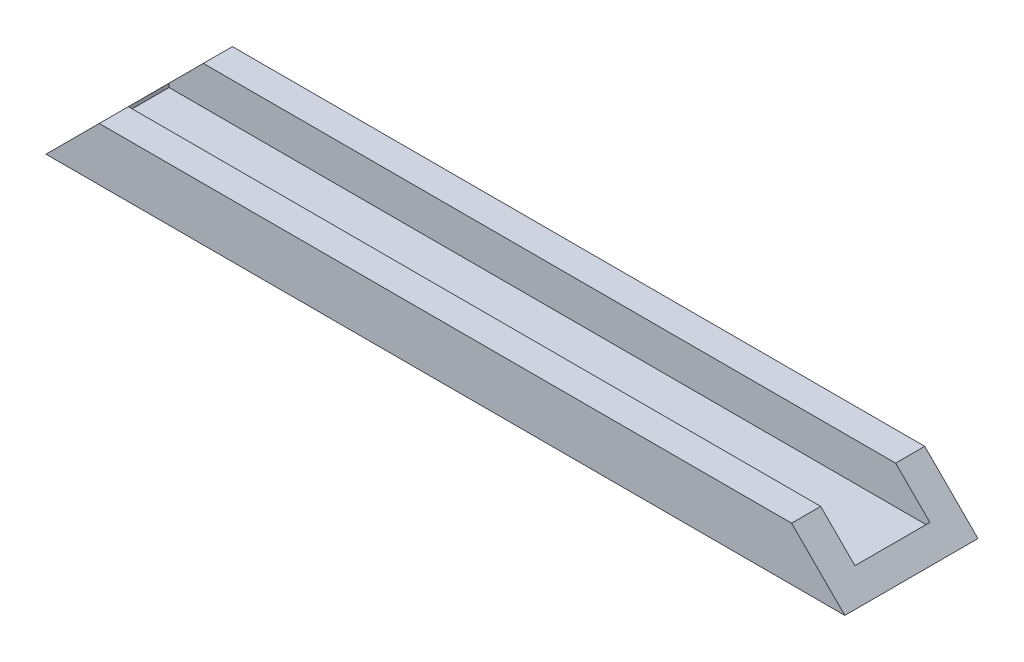
ISO-10303-21;
HEADER;
FILE_DESCRIPTION(('STEP AP214'),'2;1');
FILE_NAME('part.step','',(''),(''),'','','');
FILE_SCHEMA(('AUTOMOTIVE_DESIGN { 1 0 10303 214 1 1 1 1 }'));
ENDSEC;
DATA;
#1=APPLICATION_CONTEXT('core data for automotive mechanical design processes');
#2=APPLICATION_PROTOCOL_DEFINITION('international standard','automotive_design',2000,#1);
#3=PRODUCT_CONTEXT('',#1,'mechanical');
#4=PRODUCT('Part','Part','',(#3));
#5=PRODUCT_RELATED_PRODUCT_CATEGORY('part','',(#4));
#6=PRODUCT_DEFINITION_FORMATION('','',#4);
#7=PRODUCT_DEFINITION_CONTEXT('part definition',#1,'design');
#8=PRODUCT_DEFINITION('design','',#6,#7);
#9=PRODUCT_DEFINITION_SHAPE('','',#8);
#10=(LENGTH_UNIT() NAMED_UNIT(*) SI_UNIT(.MILLI.,.METRE.));
#11=(NAMED_UNIT(*) PLANE_ANGLE_UNIT() SI_UNIT($,.RADIAN.));
#12=(NAMED_UNIT(*) SI_UNIT($,.STERADIAN.) SOLID_ANGLE_UNIT());
#13=UNCERTAINTY_MEASURE_WITH_UNIT(LENGTH_MEASURE(1.E-05),#10,'distance_accuracy_value','');
#14=(GEOMETRIC_REPRESENTATION_CONTEXT(3) GLOBAL_UNCERTAINTY_ASSIGNED_CONTEXT((#13)) GLOBAL_UNIT_ASSIGNED_CONTEXT((#10,
#11,#12)) REPRESENTATION_CONTEXT('',''));
#15=CARTESIAN_POINT('',(0.,0.,0.));
#16=DIRECTION('',(0.,0.,1.));
#17=DIRECTION('',(1.,0.,0.));
#18=AXIS2_PLACEMENT_3D('',#15,#16,#17);
#19=CARTESIAN_POINT('',(0.,8.89,0.));
#20=DIRECTION('',(0.,-1.,0.));
#21=DIRECTION('',(0.,0.,-1.));
#22=AXIS2_PLACEMENT_3D('',#19,#20,#21);
#23=PLANE('',#22);
#24=DIRECTION('',(-1.,0.,0.));
#25=VECTOR('',#24,1.);
#26=CARTESIAN_POINT('',(0.,8.89,-22.225));
#27=LINE('',#26,#25);
#28=CARTESIAN_POINT('',(124.46,8.89000000000001,-22.225));
#29=VERTEX_POINT('',#28);
#30=CARTESIAN_POINT('',(8.89000000000008,8.89000000000001,-22.225));
#31=VERTEX_POINT('',#30);
#32=EDGE_CURVE('E129',#29,#31,#27,.T.);
#33=ORIENTED_EDGE('',*,*,#32,.T.);
#34=DIRECTION('',(0.,0.,-1.));
#35=VECTOR('',#34,1.);
#36=CARTESIAN_POINT('',(8.89000000000008,8.89000000000001,0.));
#37=LINE('',#36,#35);
#38=CARTESIAN_POINT('',(8.89000000000008,8.89000000000001,-17.36725));
#39=VERTEX_POINT('',#38);
#40=EDGE_CURVE('E115',#39,#31,#37,.T.);
#41=ORIENTED_EDGE('',*,*,#40,.F.);
#42=DIRECTION('',(-1.,0.,0.));
#43=VECTOR('',#42,1.);
#44=CARTESIAN_POINT('',(3.175,8.89,-17.36725));
#45=LINE('',#44,#43);
#46=CARTESIAN_POINT('',(124.46,8.89000000000001,-17.36725));
#47=VERTEX_POINT('',#46);
#48=EDGE_CURVE('E164',#47,#39,#45,.T.);
#49=ORIENTED_EDGE('',*,*,#48,.F.);
#50=DIRECTION('',(0.,0.,-1.));
#51=VECTOR('',#50,1.);
#52=CARTESIAN_POINT('',(124.46,8.89000000000001,0.));
#53=LINE('',#52,#51);
#54=EDGE_CURVE('E188',#47,#29,#53,.T.);
#55=ORIENTED_EDGE('',*,*,#54,.T.);
#56=EDGE_LOOP('',(#33,#41,#49,#55));
#57=FACE_BOUND('',#56,.T.);
#58=ADVANCED_FACE('F33',(#57),#23,.F.);
#59=CARTESIAN_POINT('',(0.,8.89,0.));
#60=DIRECTION('',(0.,0.,-1.));
#61=DIRECTION('',(-1.,0.,0.));
#62=AXIS2_PLACEMENT_3D('',#59,#60,#61);
#63=PLANE('',#62);
#64=DIRECTION('',(1.,0.,0.));
#65=VECTOR('',#64,1.);
#66=CARTESIAN_POINT('',(0.,8.89,0.));
#67=LINE('',#66,#65);
#68=CARTESIAN_POINT('',(8.89000000000008,8.89000000000001,0.));
#69=VERTEX_POINT('',#68);
#70=CARTESIAN_POINT('',(124.46,8.89000000000001,0.));
#71=VERTEX_POINT('',#70);
#72=EDGE_CURVE('E123',#69,#71,#67,.T.);
#73=ORIENTED_EDGE('',*,*,#72,.F.);
#74=DIRECTION('',(-0.707106781186551,-0.707106781186544,0.));
#75=VECTOR('',#74,1.);
#76=CARTESIAN_POINT('',(0.,0.,0.));
#77=LINE('',#76,#75);
#78=CARTESIAN_POINT('',(0.,0.,0.));
#79=VERTEX_POINT('',#78);
#80=EDGE_CURVE('E107',#69,#79,#77,.T.);
#81=ORIENTED_EDGE('',*,*,#80,.T.);
#82=DIRECTION('',(1.,0.,0.));
#83=VECTOR('',#82,1.);
#84=CARTESIAN_POINT('',(0.,0.,0.));
#85=LINE('',#84,#83);
#86=CARTESIAN_POINT('',(133.35,0.,0.));
#87=VERTEX_POINT('',#86);
#88=EDGE_CURVE('E142',#79,#87,#85,.T.);
#89=ORIENTED_EDGE('',*,*,#88,.T.);
#90=DIRECTION('',(-0.70710678118655,0.707106781186545,0.));
#91=VECTOR('',#90,1.);
#92=CARTESIAN_POINT('',(133.35,0.,0.));
#93=LINE('',#92,#91);
#94=EDGE_CURVE('E128',#87,#71,#93,.T.);
#95=ORIENTED_EDGE('',*,*,#94,.T.);
#96=EDGE_LOOP('',(#73,#81,#89,#95));
#97=FACE_BOUND('',#96,.T.);
#98=ADVANCED_FACE('F35',(#97),#63,.F.);
#99=CARTESIAN_POINT('',(0.,8.89,-22.225));
#100=DIRECTION('',(0.,0.,1.));
#101=DIRECTION('',(1.,0.,0.));
#102=AXIS2_PLACEMENT_3D('',#99,#100,#101);
#103=PLANE('',#102);
#104=DIRECTION('',(-1.,0.,0.));
#105=VECTOR('',#104,1.);
#106=CARTESIAN_POINT('',(0.,0.,-22.225));
#107=LINE('',#106,#105);
#108=CARTESIAN_POINT('',(133.35,0.,-22.225));
#109=VERTEX_POINT('',#108);
#110=CARTESIAN_POINT('',(0.,0.,-22.225));
#111=VERTEX_POINT('',#110);
#112=EDGE_CURVE('E130',#109,#111,#107,.T.);
#113=ORIENTED_EDGE('',*,*,#112,.T.);
#114=DIRECTION('',(-0.707106781186551,-0.707106781186544,0.));
#115=VECTOR('',#114,1.);
#116=CARTESIAN_POINT('',(0.,0.,-22.225));
#117=LINE('',#116,#115);
#118=EDGE_CURVE('E116',#31,#111,#117,.T.);
#119=ORIENTED_EDGE('',*,*,#118,.F.);
#120=ORIENTED_EDGE('',*,*,#32,.F.);
#121=DIRECTION('',(-0.70710678118655,0.707106781186545,0.));
#122=VECTOR('',#121,1.);
#123=CARTESIAN_POINT('',(133.35,0.,-22.225));
#124=LINE('',#123,#122);
#125=EDGE_CURVE('E189',#109,#29,#124,.T.);
#126=ORIENTED_EDGE('',*,*,#125,.F.);
#127=EDGE_LOOP('',(#113,#119,#120,#126));
#128=FACE_BOUND('',#127,.T.);
#129=ADVANCED_FACE('F198',(#128),#103,.F.);
#130=DIRECTION('',(1.,0.,0.));
#131=VECTOR('',#130,1.);
#132=CARTESIAN_POINT('',(3.175,8.89,-4.85775));
#133=LINE('',#132,#131);
#134=CARTESIAN_POINT('',(8.89000000000008,8.89,-4.85775));
#135=VERTEX_POINT('',#134);
#136=CARTESIAN_POINT('',(124.46,8.89000000000001,-4.85774999999998));
#137=VERTEX_POINT('',#136);
#138=EDGE_CURVE('E125',#135,#137,#133,.T.);
#139=ORIENTED_EDGE('',*,*,#138,.F.);
#140=EDGE_CURVE('E56',#69,#135,#37,.T.);
#141=ORIENTED_EDGE('',*,*,#140,.F.);
#142=ORIENTED_EDGE('',*,*,#72,.T.);
#143=EDGE_CURVE('E186',#71,#137,#53,.T.);
#144=ORIENTED_EDGE('',*,*,#143,.T.);
#145=EDGE_LOOP('',(#139,#141,#142,#144));
#146=FACE_BOUND('',#145,.T.);
#147=ADVANCED_FACE('F121',(#146),#23,.F.);
#148=CARTESIAN_POINT('',(0.,0.,0.));
#149=DIRECTION('',(0.,-1.,0.));
#150=DIRECTION('',(0.,0.,-1.));
#151=AXIS2_PLACEMENT_3D('',#148,#149,#150);
#152=PLANE('',#151);
#153=DIRECTION('',(0.,0.,1.));
#154=VECTOR('',#153,1.);
#155=CARTESIAN_POINT('',(0.,0.,0.));
#156=LINE('',#155,#154);
#157=EDGE_CURVE('E110',#111,#79,#156,.T.);
#158=ORIENTED_EDGE('',*,*,#157,.F.);
#159=ORIENTED_EDGE('',*,*,#112,.F.);
#160=DIRECTION('',(0.,0.,-1.));
#161=VECTOR('',#160,1.);
#162=CARTESIAN_POINT('',(133.35,0.,0.));
#163=LINE('',#162,#161);
#164=EDGE_CURVE('E135',#87,#109,#163,.T.);
#165=ORIENTED_EDGE('',*,*,#164,.F.);
#166=ORIENTED_EDGE('',*,*,#88,.F.);
#167=EDGE_LOOP('',(#158,#159,#165,#166));
#168=FACE_BOUND('',#167,.T.);
#169=ADVANCED_FACE('F201',(#168),#152,.T.);
#170=CARTESIAN_POINT('',(3.175,2.54,-17.36725));
#171=DIRECTION('',(-1.,0.,0.));
#172=DIRECTION('',(0.,0.,1.));
#173=AXIS2_PLACEMENT_3D('',#170,#171,#172);
#174=PLANE('',#173);
#175=DIRECTION('',(0.,1.,0.));
#176=VECTOR('',#175,1.);
#177=CARTESIAN_POINT('',(3.175,2.54,-17.36725));
#178=LINE('',#177,#176);
#179=CARTESIAN_POINT('',(3.175,2.54,-17.36725));
#180=VERTEX_POINT('',#179);
#181=CARTESIAN_POINT('',(3.175,3.17499999999999,-17.36725));
#182=VERTEX_POINT('',#181);
#183=EDGE_CURVE('E143',#180,#182,#178,.T.);
#184=ORIENTED_EDGE('',*,*,#183,.T.);
#185=DIRECTION('',(0.,0.,1.));
#186=VECTOR('',#185,1.);
#187=CARTESIAN_POINT('',(3.175,3.17499999999999,-17.36725));
#188=LINE('',#187,#186);
#189=CARTESIAN_POINT('',(3.175,3.17499999999999,-4.85775));
#190=VERTEX_POINT('',#189);
#191=EDGE_CURVE('E179',#182,#190,#188,.T.);
#192=ORIENTED_EDGE('',*,*,#191,.T.);
#193=DIRECTION('',(0.,1.,0.));
#194=VECTOR('',#193,1.);
#195=CARTESIAN_POINT('',(3.175,2.54,-4.85775));
#196=LINE('',#195,#194);
#197=CARTESIAN_POINT('',(3.175,2.54,-4.85775));
#198=VERTEX_POINT('',#197);
#199=EDGE_CURVE('E138',#198,#190,#196,.T.);
#200=ORIENTED_EDGE('',*,*,#199,.F.);
#201=DIRECTION('',(0.,0.,1.));
#202=VECTOR('',#201,1.);
#203=CARTESIAN_POINT('',(3.175,2.54,-17.36725));
#204=LINE('',#203,#202);
#205=EDGE_CURVE('E167',#180,#198,#204,.T.);
#206=ORIENTED_EDGE('',*,*,#205,.F.);
#207=EDGE_LOOP('',(#184,#192,#200,#206));
#208=FACE_BOUND('',#207,.T.);
#209=ADVANCED_FACE('F213',(#208),#174,.F.);
#210=CARTESIAN_POINT('',(3.175,2.54,-17.36725));
#211=DIRECTION('',(0.,0.,-1.));
#212=DIRECTION('',(-1.,0.,0.));
#213=AXIS2_PLACEMENT_3D('',#210,#211,#212);
#214=PLANE('',#213);
#215=ORIENTED_EDGE('',*,*,#48,.T.);
#216=DIRECTION('',(-0.707106781186551,-0.707106781186544,0.));
#217=VECTOR('',#216,1.);
#218=CARTESIAN_POINT('',(2.85750000000001,2.8575,-17.36725));
#219=LINE('',#218,#217);
#220=EDGE_CURVE('E169',#39,#182,#219,.T.);
#221=ORIENTED_EDGE('',*,*,#220,.T.);
#222=ORIENTED_EDGE('',*,*,#183,.F.);
#223=DIRECTION('',(-1.,0.,0.));
#224=VECTOR('',#223,1.);
#225=CARTESIAN_POINT('',(3.175,2.54,-17.36725));
#226=LINE('',#225,#224);
#227=CARTESIAN_POINT('',(130.175,2.54,-17.36725));
#228=VERTEX_POINT('',#227);
#229=EDGE_CURVE('E160',#228,#180,#226,.T.);
#230=ORIENTED_EDGE('',*,*,#229,.F.);
#231=DIRECTION('',(0.,1.,0.));
#232=VECTOR('',#231,1.);
#233=CARTESIAN_POINT('',(130.175,2.54,-17.36725));
#234=LINE('',#233,#232);
#235=CARTESIAN_POINT('',(130.175,3.17499999999993,-17.36725));
#236=VERTEX_POINT('',#235);
#237=EDGE_CURVE('E158',#228,#236,#234,.T.);
#238=ORIENTED_EDGE('',*,*,#237,.T.);
#239=DIRECTION('',(-0.70710678118655,0.707106781186545,0.));
#240=VECTOR('',#239,1.);
#241=CARTESIAN_POINT('',(66.9924999999994,66.3575,-17.36725));
#242=LINE('',#241,#240);
#243=EDGE_CURVE('E182',#236,#47,#242,.T.);
#244=ORIENTED_EDGE('',*,*,#243,.T.);
#245=EDGE_LOOP('',(#215,#221,#222,#230,#238,#244));
#246=FACE_BOUND('',#245,.T.);
#247=ADVANCED_FACE('F207',(#246),#214,.F.);
#248=CARTESIAN_POINT('',(130.175,2.54,-17.36725));
#249=DIRECTION('',(1.,0.,0.));
#250=DIRECTION('',(0.,0.,-1.));
#251=AXIS2_PLACEMENT_3D('',#248,#249,#250);
#252=PLANE('',#251);
#253=DIRECTION('',(0.,1.,0.));
#254=VECTOR('',#253,1.);
#255=CARTESIAN_POINT('',(130.175,2.54,-4.85774999999998));
#256=LINE('',#255,#254);
#257=CARTESIAN_POINT('',(130.175,2.54,-4.85774999999998));
#258=VERTEX_POINT('',#257);
#259=CARTESIAN_POINT('',(130.175,3.17499999999991,-4.85774999999998));
#260=VERTEX_POINT('',#259);
#261=EDGE_CURVE('E150',#258,#260,#256,.T.);
#262=ORIENTED_EDGE('',*,*,#261,.T.);
#263=DIRECTION('',(0.,0.,-1.));
#264=VECTOR('',#263,1.);
#265=CARTESIAN_POINT('',(130.175,3.17499999999993,-17.36725));
#266=LINE('',#265,#264);
#267=EDGE_CURVE('E48',#260,#236,#266,.T.);
#268=ORIENTED_EDGE('',*,*,#267,.T.);
#269=ORIENTED_EDGE('',*,*,#237,.F.);
#270=DIRECTION('',(0.,0.,-1.));
#271=VECTOR('',#270,1.);
#272=CARTESIAN_POINT('',(130.175,2.54,-17.36725));
#273=LINE('',#272,#271);
#274=EDGE_CURVE('E156',#258,#228,#273,.T.);
#275=ORIENTED_EDGE('',*,*,#274,.F.);
#276=EDGE_LOOP('',(#262,#268,#269,#275));
#277=FACE_BOUND('',#276,.T.);
#278=ADVANCED_FACE('F153',(#277),#252,.F.);
#279=CARTESIAN_POINT('',(3.175,2.54,-4.85775));
#280=DIRECTION('',(0.,0.,1.));
#281=DIRECTION('',(1.,0.,0.));
#282=AXIS2_PLACEMENT_3D('',#279,#280,#281);
#283=PLANE('',#282);
#284=ORIENTED_EDGE('',*,*,#199,.T.);
#285=DIRECTION('',(0.707106781186551,0.707106781186544,0.));
#286=VECTOR('',#285,1.);
#287=CARTESIAN_POINT('',(2.85750000000001,2.8575,-4.85775));
#288=LINE('',#287,#286);
#289=EDGE_CURVE('E11',#190,#135,#288,.T.);
#290=ORIENTED_EDGE('',*,*,#289,.T.);
#291=ORIENTED_EDGE('',*,*,#138,.T.);
#292=DIRECTION('',(0.70710678118655,-0.707106781186545,0.));
#293=VECTOR('',#292,1.);
#294=CARTESIAN_POINT('',(66.9924999999994,66.3575,-4.85774999999999));
#295=LINE('',#294,#293);
#296=EDGE_CURVE('E41',#137,#260,#295,.T.);
#297=ORIENTED_EDGE('',*,*,#296,.T.);
#298=ORIENTED_EDGE('',*,*,#261,.F.);
#299=DIRECTION('',(1.,0.,0.));
#300=VECTOR('',#299,1.);
#301=CARTESIAN_POINT('',(3.175,2.54,-4.85775));
#302=LINE('',#301,#300);
#303=EDGE_CURVE('E173',#198,#258,#302,.T.);
#304=ORIENTED_EDGE('',*,*,#303,.F.);
#305=EDGE_LOOP('',(#284,#290,#291,#297,#298,#304));
#306=FACE_BOUND('',#305,.T.);
#307=ADVANCED_FACE('F148',(#306),#283,.F.);
#308=CARTESIAN_POINT('',(0.,2.54,0.));
#309=DIRECTION('',(0.,1.,0.));
#310=DIRECTION('',(0.,0.,1.));
#311=AXIS2_PLACEMENT_3D('',#308,#309,#310);
#312=PLANE('',#311);
#313=ORIENTED_EDGE('',*,*,#205,.T.);
#314=ORIENTED_EDGE('',*,*,#303,.T.);
#315=ORIENTED_EDGE('',*,*,#274,.T.);
#316=ORIENTED_EDGE('',*,*,#229,.T.);
#317=EDGE_LOOP('',(#313,#314,#315,#316));
#318=FACE_BOUND('',#317,.T.);
#319=ADVANCED_FACE('F210',(#318),#312,.T.);
#320=CARTESIAN_POINT('',(133.35,0.,0.));
#321=DIRECTION('',(-0.707106781186545,-0.70710678118655,0.));
#322=DIRECTION('',(0.70710678118655,-0.707106781186545,0.));
#323=AXIS2_PLACEMENT_3D('',#320,#321,#322);
#324=PLANE('',#323);
#325=ORIENTED_EDGE('',*,*,#267,.F.);
#326=ORIENTED_EDGE('',*,*,#296,.F.);
#327=ORIENTED_EDGE('',*,*,#143,.F.);
#328=ORIENTED_EDGE('',*,*,#94,.F.);
#329=ORIENTED_EDGE('',*,*,#164,.T.);
#330=ORIENTED_EDGE('',*,*,#125,.T.);
#331=ORIENTED_EDGE('',*,*,#54,.F.);
#332=ORIENTED_EDGE('',*,*,#243,.F.);
#333=EDGE_LOOP('',(#325,#326,#327,#328,#329,#330,#331,#332));
#334=FACE_BOUND('',#333,.T.);
#335=ADVANCED_FACE('F202',(#334),#324,.F.);
#336=CARTESIAN_POINT('',(0.,0.,0.));
#337=DIRECTION('',(0.707106781186544,-0.707106781186551,0.));
#338=DIRECTION('',(0.707106781186551,0.707106781186544,0.));
#339=AXIS2_PLACEMENT_3D('',#336,#337,#338);
#340=PLANE('',#339);
#341=ORIENTED_EDGE('',*,*,#40,.T.);
#342=ORIENTED_EDGE('',*,*,#118,.T.);
#343=ORIENTED_EDGE('',*,*,#157,.T.);
#344=ORIENTED_EDGE('',*,*,#80,.F.);
#345=ORIENTED_EDGE('',*,*,#140,.T.);
#346=ORIENTED_EDGE('',*,*,#289,.F.);
#347=ORIENTED_EDGE('',*,*,#191,.F.);
#348=ORIENTED_EDGE('',*,*,#220,.F.);
#349=EDGE_LOOP('',(#341,#342,#343,#344,#345,#346,#347,#348));
#350=FACE_BOUND('',#349,.T.);
#351=ADVANCED_FACE('F108',(#350),#340,.F.);
#352=CLOSED_SHELL('',(#58,#98,#129,#147,#169,#209,#247,#278,#307,#319,#335,#351));
#353=MANIFOLD_SOLID_BREP('B2',#352);
#354=ADVANCED_BREP_SHAPE_REPRESENTATION('',(#18,#353),#14);
#355=SHAPE_DEFINITION_REPRESENTATION(#9,#354);
ENDSEC;
END-ISO-10303-21;
